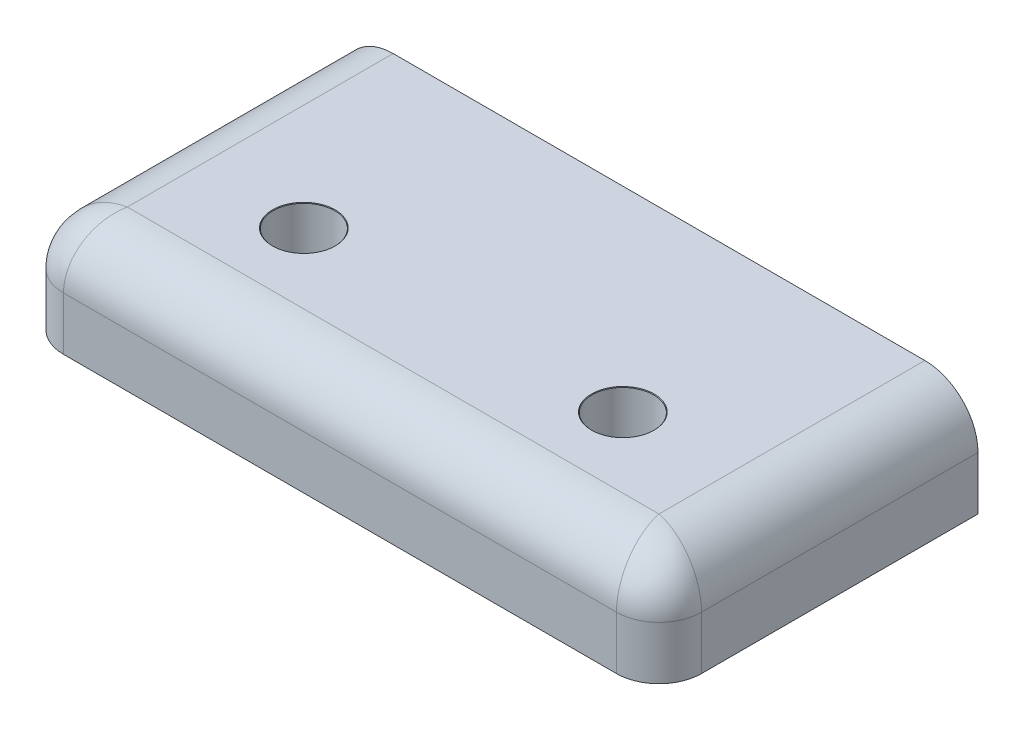
ISO-10303-21;
HEADER;
FILE_DESCRIPTION(('STEP AP214'),'2;1');
FILE_NAME('part.step','',(''),(''),'','','');
FILE_SCHEMA(('AUTOMOTIVE_DESIGN { 1 0 10303 214 1 1 1 1 }'));
ENDSEC;
DATA;
#1=APPLICATION_CONTEXT('core data for automotive mechanical design processes');
#2=APPLICATION_PROTOCOL_DEFINITION('international standard','automotive_design',2000,#1);
#3=PRODUCT_CONTEXT('',#1,'mechanical');
#4=PRODUCT('Part','Part','',(#3));
#5=PRODUCT_RELATED_PRODUCT_CATEGORY('part','',(#4));
#6=PRODUCT_DEFINITION_FORMATION('','',#4);
#7=PRODUCT_DEFINITION_CONTEXT('part definition',#1,'design');
#8=PRODUCT_DEFINITION('design','',#6,#7);
#9=PRODUCT_DEFINITION_SHAPE('','',#8);
#10=(LENGTH_UNIT() NAMED_UNIT(*) SI_UNIT(.MILLI.,.METRE.));
#11=(NAMED_UNIT(*) PLANE_ANGLE_UNIT() SI_UNIT($,.RADIAN.));
#12=(NAMED_UNIT(*) SI_UNIT($,.STERADIAN.) SOLID_ANGLE_UNIT());
#13=UNCERTAINTY_MEASURE_WITH_UNIT(LENGTH_MEASURE(1.E-05),#10,'distance_accuracy_value','');
#14=(GEOMETRIC_REPRESENTATION_CONTEXT(3) GLOBAL_UNCERTAINTY_ASSIGNED_CONTEXT((#13)) GLOBAL_UNIT_ASSIGNED_CONTEXT((#10,
#11,#12)) REPRESENTATION_CONTEXT('',''));
#15=CARTESIAN_POINT('',(0.,0.,0.));
#16=DIRECTION('',(0.,0.,1.));
#17=DIRECTION('',(1.,0.,0.));
#18=AXIS2_PLACEMENT_3D('',#15,#16,#17);
#19=CARTESIAN_POINT('',(-15.,5.,7.5));
#20=DIRECTION('',(1.,0.,0.));
#21=DIRECTION('',(0.,0.,-1.));
#22=AXIS2_PLACEMENT_3D('',#19,#20,#21);
#23=PLANE('',#22);
#24=DIRECTION('',(0.,-1.,0.));
#25=VECTOR('',#24,1.);
#26=CARTESIAN_POINT('',(-15.,5.,5.5));
#27=LINE('',#26,#25);
#28=CARTESIAN_POINT('',(-15.,0.,5.5));
#29=VERTEX_POINT('',#28);
#30=CARTESIAN_POINT('',(-15.,2.5,5.5));
#31=VERTEX_POINT('',#30);
#32=EDGE_CURVE('E144',#29,#31,#27,.F.);
#33=ORIENTED_EDGE('',*,*,#32,.T.);
#34=DIRECTION('',(0.,0.,1.));
#35=VECTOR('',#34,1.);
#36=CARTESIAN_POINT('',(-15.,2.5,-7.5));
#37=LINE('',#36,#35);
#38=CARTESIAN_POINT('',(-15.,2.5,-7.5));
#39=VERTEX_POINT('',#38);
#40=EDGE_CURVE('E11',#31,#39,#37,.F.);
#41=ORIENTED_EDGE('',*,*,#40,.T.);
#42=DIRECTION('',(0.,-1.,0.));
#43=VECTOR('',#42,1.);
#44=CARTESIAN_POINT('',(-15.,5.,-7.5));
#45=LINE('',#44,#43);
#46=CARTESIAN_POINT('',(-15.,0.,-7.5));
#47=VERTEX_POINT('',#46);
#48=EDGE_CURVE('E115',#39,#47,#45,.T.);
#49=ORIENTED_EDGE('',*,*,#48,.T.);
#50=DIRECTION('',(0.,0.,1.));
#51=VECTOR('',#50,1.);
#52=CARTESIAN_POINT('',(-15.,0.,7.5));
#53=LINE('',#52,#51);
#54=EDGE_CURVE('E129',#47,#29,#53,.T.);
#55=ORIENTED_EDGE('',*,*,#54,.T.);
#56=EDGE_LOOP('',(#33,#41,#49,#55));
#57=FACE_BOUND('',#56,.T.);
#58=ADVANCED_FACE('F35',(#57),#23,.F.);
#59=CARTESIAN_POINT('',(15.,5.,7.5));
#60=DIRECTION('',(0.,0.,-1.));
#61=DIRECTION('',(-1.,0.,0.));
#62=AXIS2_PLACEMENT_3D('',#59,#60,#61);
#63=PLANE('',#62);
#64=DIRECTION('',(0.,-1.,0.));
#65=VECTOR('',#64,1.);
#66=CARTESIAN_POINT('',(13.,5.,7.5));
#67=LINE('',#66,#65);
#68=CARTESIAN_POINT('',(13.,0.,7.5));
#69=VERTEX_POINT('',#68);
#70=CARTESIAN_POINT('',(13.,2.5,7.5));
#71=VERTEX_POINT('',#70);
#72=EDGE_CURVE('E114',#69,#71,#67,.F.);
#73=ORIENTED_EDGE('',*,*,#72,.T.);
#74=DIRECTION('',(1.,0.,0.));
#75=VECTOR('',#74,1.);
#76=CARTESIAN_POINT('',(-13.,2.5,7.5));
#77=LINE('',#76,#75);
#78=CARTESIAN_POINT('',(-13.,2.5,7.5));
#79=VERTEX_POINT('',#78);
#80=EDGE_CURVE('E60',#71,#79,#77,.F.);
#81=ORIENTED_EDGE('',*,*,#80,.T.);
#82=DIRECTION('',(0.,-1.,0.));
#83=VECTOR('',#82,1.);
#84=CARTESIAN_POINT('',(-13.,5.,7.5));
#85=LINE('',#84,#83);
#86=CARTESIAN_POINT('',(-13.,0.,7.5));
#87=VERTEX_POINT('',#86);
#88=EDGE_CURVE('E138',#79,#87,#85,.T.);
#89=ORIENTED_EDGE('',*,*,#88,.T.);
#90=DIRECTION('',(1.,0.,0.));
#91=VECTOR('',#90,1.);
#92=CARTESIAN_POINT('',(15.,0.,7.5));
#93=LINE('',#92,#91);
#94=EDGE_CURVE('E124',#87,#69,#93,.T.);
#95=ORIENTED_EDGE('',*,*,#94,.T.);
#96=EDGE_LOOP('',(#73,#81,#89,#95));
#97=FACE_BOUND('',#96,.T.);
#98=ADVANCED_FACE('F201',(#97),#63,.F.);
#99=CARTESIAN_POINT('',(15.,5.,7.5));
#100=DIRECTION('',(-1.,0.,0.));
#101=DIRECTION('',(0.,0.,1.));
#102=AXIS2_PLACEMENT_3D('',#99,#100,#101);
#103=PLANE('',#102);
#104=DIRECTION('',(0.,-1.,0.));
#105=VECTOR('',#104,1.);
#106=CARTESIAN_POINT('',(15.,5.,-7.5));
#107=LINE('',#106,#105);
#108=CARTESIAN_POINT('',(15.,2.5,-7.5));
#109=VERTEX_POINT('',#108);
#110=CARTESIAN_POINT('',(15.,0.,-7.5));
#111=VERTEX_POINT('',#110);
#112=EDGE_CURVE('E103',#109,#111,#107,.T.);
#113=ORIENTED_EDGE('',*,*,#112,.F.);
#114=DIRECTION('',(0.,0.,-1.));
#115=VECTOR('',#114,1.);
#116=CARTESIAN_POINT('',(15.,2.5,5.5));
#117=LINE('',#116,#115);
#118=CARTESIAN_POINT('',(15.,2.5,5.5));
#119=VERTEX_POINT('',#118);
#120=EDGE_CURVE('E157',#109,#119,#117,.F.);
#121=ORIENTED_EDGE('',*,*,#120,.T.);
#122=DIRECTION('',(0.,-1.,0.));
#123=VECTOR('',#122,1.);
#124=CARTESIAN_POINT('',(15.,5.,5.5));
#125=LINE('',#124,#123);
#126=CARTESIAN_POINT('',(15.,0.,5.5));
#127=VERTEX_POINT('',#126);
#128=EDGE_CURVE('E121',#119,#127,#125,.T.);
#129=ORIENTED_EDGE('',*,*,#128,.T.);
#130=DIRECTION('',(0.,0.,-1.));
#131=VECTOR('',#130,1.);
#132=CARTESIAN_POINT('',(15.,0.,7.5));
#133=LINE('',#132,#131);
#134=EDGE_CURVE('E118',#127,#111,#133,.T.);
#135=ORIENTED_EDGE('',*,*,#134,.T.);
#136=EDGE_LOOP('',(#113,#121,#129,#135));
#137=FACE_BOUND('',#136,.T.);
#138=ADVANCED_FACE('F119',(#137),#103,.F.);
#139=CARTESIAN_POINT('',(15.,5.,-7.5));
#140=DIRECTION('',(0.,0.,1.));
#141=DIRECTION('',(1.,0.,0.));
#142=AXIS2_PLACEMENT_3D('',#139,#140,#141);
#143=PLANE('',#142);
#144=DIRECTION('',(-1.,0.,0.));
#145=VECTOR('',#144,1.);
#146=CARTESIAN_POINT('',(15.,5.,-7.5));
#147=LINE('',#146,#145);
#148=CARTESIAN_POINT('',(12.5,5.,-7.5));
#149=VERTEX_POINT('',#148);
#150=CARTESIAN_POINT('',(-12.5,5.,-7.5));
#151=VERTEX_POINT('',#150);
#152=EDGE_CURVE('E130',#149,#151,#147,.T.);
#153=ORIENTED_EDGE('',*,*,#152,.F.);
#154=CARTESIAN_POINT('',(12.5,2.5,-7.5));
#155=DIRECTION('',(0.,0.,1.));
#156=DIRECTION('',(1.,0.,0.));
#157=AXIS2_PLACEMENT_3D('',#154,#155,#156);
#158=CIRCLE('',#157,2.5);
#159=EDGE_CURVE('E111',#149,#109,#158,.F.);
#160=ORIENTED_EDGE('',*,*,#159,.T.);
#161=ORIENTED_EDGE('',*,*,#112,.T.);
#162=DIRECTION('',(-1.,0.,0.));
#163=VECTOR('',#162,1.);
#164=CARTESIAN_POINT('',(15.,0.,-7.5));
#165=LINE('',#164,#163);
#166=EDGE_CURVE('E109',#111,#47,#165,.T.);
#167=ORIENTED_EDGE('',*,*,#166,.T.);
#168=ORIENTED_EDGE('',*,*,#48,.F.);
#169=CARTESIAN_POINT('',(-12.5,2.5,-7.5));
#170=DIRECTION('',(0.,0.,1.));
#171=DIRECTION('',(1.,0.,0.));
#172=AXIS2_PLACEMENT_3D('',#169,#170,#171);
#173=CIRCLE('',#172,2.5);
#174=EDGE_CURVE('E154',#39,#151,#173,.F.);
#175=ORIENTED_EDGE('',*,*,#174,.T.);
#176=EDGE_LOOP('',(#153,#160,#161,#167,#168,#175));
#177=FACE_BOUND('',#176,.T.);
#178=ADVANCED_FACE('F106',(#177),#143,.F.);
#179=CARTESIAN_POINT('',(0.,5.,0.));
#180=DIRECTION('',(0.,1.,0.));
#181=DIRECTION('',(0.,0.,1.));
#182=AXIS2_PLACEMENT_3D('',#179,#180,#181);
#183=PLANE('',#182);
#184=CARTESIAN_POINT('',(-7.5,5.,1.7));
#185=DIRECTION('',(0.,1.,0.));
#186=DIRECTION('',(0.,0.,1.));
#187=AXIS2_PLACEMENT_3D('',#184,#185,#186);
#188=CIRCLE('',#187,1.475);
#189=CARTESIAN_POINT('',(-7.5,5.,3.175));
#190=VERTEX_POINT('',#189);
#191=EDGE_CURVE('E249',#190,#190,#188,.T.);
#192=ORIENTED_EDGE('',*,*,#191,.F.);
#193=EDGE_LOOP('',(#192));
#194=FACE_BOUND('',#193,.T.);
#195=CARTESIAN_POINT('',(7.5,5.,1.7));
#196=DIRECTION('',(0.,1.,0.));
#197=DIRECTION('',(0.,0.,1.));
#198=AXIS2_PLACEMENT_3D('',#195,#196,#197);
#199=CIRCLE('',#198,1.475);
#200=CARTESIAN_POINT('',(7.5,5.,3.175));
#201=VERTEX_POINT('',#200);
#202=EDGE_CURVE('E240',#201,#201,#199,.T.);
#203=ORIENTED_EDGE('',*,*,#202,.F.);
#204=EDGE_LOOP('',(#203));
#205=FACE_BOUND('',#204,.T.);
#206=DIRECTION('',(1.,0.,0.));
#207=VECTOR('',#206,1.);
#208=CARTESIAN_POINT('',(13.,5.,5.));
#209=LINE('',#208,#207);
#210=CARTESIAN_POINT('',(-12.5,5.,5.));
#211=VERTEX_POINT('',#210);
#212=CARTESIAN_POINT('',(12.5,5.,5.));
#213=VERTEX_POINT('',#212);
#214=EDGE_CURVE('E149',#211,#213,#209,.T.);
#215=ORIENTED_EDGE('',*,*,#214,.T.);
#216=DIRECTION('',(0.,0.,-1.));
#217=VECTOR('',#216,1.);
#218=CARTESIAN_POINT('',(12.5,5.,-7.5));
#219=LINE('',#218,#217);
#220=EDGE_CURVE('E151',#213,#149,#219,.T.);
#221=ORIENTED_EDGE('',*,*,#220,.T.);
#222=ORIENTED_EDGE('',*,*,#152,.T.);
#223=DIRECTION('',(0.,0.,1.));
#224=VECTOR('',#223,1.);
#225=CARTESIAN_POINT('',(-12.5,5.,5.5));
#226=LINE('',#225,#224);
#227=EDGE_CURVE('E147',#151,#211,#226,.T.);
#228=ORIENTED_EDGE('',*,*,#227,.T.);
#229=EDGE_LOOP('',(#215,#221,#222,#228));
#230=FACE_BOUND('',#229,.T.);
#231=ADVANCED_FACE('F223',(#194,#205,#230),#183,.T.);
#232=CARTESIAN_POINT('',(0.,0.,0.));
#233=DIRECTION('',(0.,1.,0.));
#234=DIRECTION('',(0.,0.,1.));
#235=AXIS2_PLACEMENT_3D('',#232,#233,#234);
#236=PLANE('',#235);
#237=CARTESIAN_POINT('',(-7.5,0.,1.7));
#238=DIRECTION('',(0.,1.,0.));
#239=DIRECTION('',(0.,0.,1.));
#240=AXIS2_PLACEMENT_3D('',#237,#238,#239);
#241=CIRCLE('',#240,1.45);
#242=CARTESIAN_POINT('',(-7.5,0.,3.15));
#243=VERTEX_POINT('',#242);
#244=EDGE_CURVE('E243',#243,#243,#241,.T.);
#245=ORIENTED_EDGE('',*,*,#244,.T.);
#246=EDGE_LOOP('',(#245));
#247=FACE_BOUND('',#246,.T.);
#248=CARTESIAN_POINT('',(7.5,0.,1.7));
#249=DIRECTION('',(0.,1.,0.));
#250=DIRECTION('',(0.,0.,1.));
#251=AXIS2_PLACEMENT_3D('',#248,#249,#250);
#252=CIRCLE('',#251,1.45);
#253=CARTESIAN_POINT('',(7.5,0.,3.15));
#254=VERTEX_POINT('',#253);
#255=EDGE_CURVE('E167',#254,#254,#252,.T.);
#256=ORIENTED_EDGE('',*,*,#255,.T.);
#257=EDGE_LOOP('',(#256));
#258=FACE_BOUND('',#257,.T.);
#259=ORIENTED_EDGE('',*,*,#94,.F.);
#260=CARTESIAN_POINT('',(-13.,0.,5.5));
#261=DIRECTION('',(0.,1.,0.));
#262=DIRECTION('',(0.,0.,1.));
#263=AXIS2_PLACEMENT_3D('',#260,#261,#262);
#264=CIRCLE('',#263,2.);
#265=EDGE_CURVE('E142',#87,#29,#264,.F.);
#266=ORIENTED_EDGE('',*,*,#265,.T.);
#267=ORIENTED_EDGE('',*,*,#54,.F.);
#268=ORIENTED_EDGE('',*,*,#166,.F.);
#269=ORIENTED_EDGE('',*,*,#134,.F.);
#270=CARTESIAN_POINT('',(13.,0.,5.5));
#271=DIRECTION('',(0.,1.,0.));
#272=DIRECTION('',(0.,0.,1.));
#273=AXIS2_PLACEMENT_3D('',#270,#271,#272);
#274=CIRCLE('',#273,2.);
#275=EDGE_CURVE('E140',#127,#69,#274,.F.);
#276=ORIENTED_EDGE('',*,*,#275,.T.);
#277=EDGE_LOOP('',(#259,#266,#267,#268,#269,#276));
#278=FACE_BOUND('',#277,.T.);
#279=ADVANCED_FACE('F127',(#247,#258,#278),#236,.F.);
#280=CARTESIAN_POINT('',(-13.,5.,5.5));
#281=DIRECTION('',(0.,-1.,0.));
#282=DIRECTION('',(0.,0.,-1.));
#283=AXIS2_PLACEMENT_3D('',#280,#281,#282);
#284=CYLINDRICAL_SURFACE('',#283,2.);
#285=ORIENTED_EDGE('',*,*,#88,.F.);
#286=CARTESIAN_POINT('',(-13.,2.5,5.5));
#287=DIRECTION('',(0.,-1.,0.));
#288=DIRECTION('',(0.,0.,-1.));
#289=AXIS2_PLACEMENT_3D('',#286,#287,#288);
#290=CIRCLE('',#289,2.);
#291=EDGE_CURVE('E45',#79,#31,#290,.T.);
#292=ORIENTED_EDGE('',*,*,#291,.T.);
#293=ORIENTED_EDGE('',*,*,#32,.F.);
#294=ORIENTED_EDGE('',*,*,#265,.F.);
#295=EDGE_LOOP('',(#285,#292,#293,#294));
#296=FACE_BOUND('',#295,.T.);
#297=ADVANCED_FACE('F210',(#296),#284,.T.);
#298=CARTESIAN_POINT('',(13.,5.,5.5));
#299=DIRECTION('',(0.,-1.,0.));
#300=DIRECTION('',(0.,0.,-1.));
#301=AXIS2_PLACEMENT_3D('',#298,#299,#300);
#302=CYLINDRICAL_SURFACE('',#301,2.);
#303=ORIENTED_EDGE('',*,*,#128,.F.);
#304=CARTESIAN_POINT('',(13.,2.5,5.5));
#305=DIRECTION('',(0.,-1.,0.));
#306=DIRECTION('',(0.,0.,-1.));
#307=AXIS2_PLACEMENT_3D('',#304,#305,#306);
#308=CIRCLE('',#307,2.);
#309=EDGE_CURVE('E159',#119,#71,#308,.T.);
#310=ORIENTED_EDGE('',*,*,#309,.T.);
#311=ORIENTED_EDGE('',*,*,#72,.F.);
#312=ORIENTED_EDGE('',*,*,#275,.F.);
#313=EDGE_LOOP('',(#303,#310,#311,#312));
#314=FACE_BOUND('',#313,.T.);
#315=ADVANCED_FACE('F197',(#314),#302,.T.);
#316=CARTESIAN_POINT('',(-12.5,2.5,0.));
#317=DIRECTION('',(0.,0.,-1.));
#318=DIRECTION('',(-1.,0.,0.));
#319=AXIS2_PLACEMENT_3D('',#316,#317,#318);
#320=CYLINDRICAL_SURFACE('',#319,2.5);
#321=ORIENTED_EDGE('',*,*,#174,.F.);
#322=ORIENTED_EDGE('',*,*,#40,.F.);
#323=CARTESIAN_POINT('',(-12.5,2.5,5.));
#324=DIRECTION('',(0.196116135138184,0.,0.98058067569092));
#325=DIRECTION('',(-0.98058067569092,0.,0.196116135138184));
#326=AXIS2_PLACEMENT_3D('',#323,#324,#325);
#327=ELLIPSE('',#326,2.54950975679639,2.5);
#328=EDGE_CURVE('E229',#211,#31,#327,.T.);
#329=ORIENTED_EDGE('',*,*,#328,.F.);
#330=ORIENTED_EDGE('',*,*,#227,.F.);
#331=EDGE_LOOP('',(#321,#322,#329,#330));
#332=FACE_BOUND('',#331,.T.);
#333=ADVANCED_FACE('F37',(#332),#320,.T.);
#334=CARTESIAN_POINT('',(-12.5,0.,5.));
#335=CARTESIAN_POINT('',(-12.5,0.,5.));
#336=CARTESIAN_POINT('',(-12.5,0.,5.));
#337=CARTESIAN_POINT('',(-12.5217823735519,4.38190625179536E-05,5.10891186775949));
#338=CARTESIAN_POINT('',(-12.5653589836663,9.78970066464025E-05,5.06535898366626));
#339=CARTESIAN_POINT('',(-12.6089118677595,4.38190625190717E-05,5.0217823735519));
#340=CARTESIAN_POINT('',(-12.5435703088954,0.00712060928854364,5.21785154447707));
#341=CARTESIAN_POINT('',(-12.6308997973074,0.00143180709654059,5.13089979730739));
#342=CARTESIAN_POINT('',(-12.7178515444771,0.00712060928854435,5.04357030889541));
#343=CARTESIAN_POINT('',(-12.5867714969681,0.0355338138611235,5.43385748484046));
#344=CARTESIAN_POINT('',(-12.7627340708859,0.00726267264234826,5.26273407088592));
#345=CARTESIAN_POINT('',(-12.9338574848405,0.0355338138611228,5.08677149696809));
#346=CARTESIAN_POINT('',(-12.6081863603207,0.0567485116522609,5.54093180160343));
#347=CARTESIAN_POINT('',(-12.8293982502122,0.0117671299591312,5.32939825021221));
#348=CARTESIAN_POINT('',(-13.0409318016034,0.0567485116522591,5.10818636032069));
#349=CARTESIAN_POINT('',(-12.6502767096491,0.113145385695364,5.75138354824547));
#350=CARTESIAN_POINT('',(-12.9646156653177,0.0246731877577231,5.46461566531766));
#351=CARTESIAN_POINT('',(-13.2513835482455,0.113145385695362,5.15027670964909));
#352=CARTESIAN_POINT('',(-12.6709585724816,0.148087317694386,5.85479286240807));
#353=CARTESIAN_POINT('',(-13.033534737398,0.0330888143773044,5.53353473739795));
#354=CARTESIAN_POINT('',(-13.3547928624081,0.148087317694386,5.17095857248161));
#355=CARTESIAN_POINT('',(-12.7112227334933,0.231475107116418,6.05611366746671));
#356=CARTESIAN_POINT('',(-13.1744002656161,0.0554429396409673,5.67440026561609));
#357=CARTESIAN_POINT('',(-13.5561136674667,0.231475107116418,5.21122273349334));
#358=CARTESIAN_POINT('',(-12.7308195679233,0.279567098892935,6.15409783961664));
#359=CARTESIAN_POINT('',(-13.2466992961838,0.0693957374026386,5.74669929618377));
#360=CARTESIAN_POINT('',(-13.6540978396166,0.279567098892935,5.23081956792333));
#361=CARTESIAN_POINT('',(-12.76856991767,0.388543470829655,6.34284958834988));
#362=CARTESIAN_POINT('',(-13.3953567235774,0.10541149346891,5.89535672357741));
#363=CARTESIAN_POINT('',(-13.8428495883499,0.388543470829654,5.26856991766997));
#364=CARTESIAN_POINT('',(-12.7867495193356,0.448971943882772,6.43374759667783));
#365=CARTESIAN_POINT('',(-13.4720420377174,0.127477567418021,5.97204203771743));
#366=CARTESIAN_POINT('',(-13.9337475966778,0.448971943882772,5.28674951933557));
#367=CARTESIAN_POINT('',(-12.8213420383227,0.581691293487432,6.60671019161367));
#368=CARTESIAN_POINT('',(-13.6301349483202,0.183637375236751,6.13013494832021));
#369=CARTESIAN_POINT('',(-14.1067101916137,0.581691293487432,5.32134203832273));
#370=CARTESIAN_POINT('',(-12.8377958358128,0.65344424644474,6.68897917906409));
#371=CARTESIAN_POINT('',(-13.7118230669507,0.217698904903522,6.21182306695074));
#372=CARTESIAN_POINT('',(-14.1889791790641,0.653444246444741,5.33779583581282));
#373=CARTESIAN_POINT('',(-12.8686396401377,0.80766527770349,6.84319820068864));
#374=CARTESIAN_POINT('',(-13.8796879642115,0.303338883814454,6.37968796421146));
#375=CARTESIAN_POINT('',(-14.3431982006886,0.807665277703493,5.36863964013773));
#376=CARTESIAN_POINT('',(-12.883087706164,0.889546641603582,6.91543853081997));
#377=CARTESIAN_POINT('',(-13.9660687274198,0.354804154050558,6.46606872741979));
#378=CARTESIAN_POINT('',(-14.41543853082,0.889546641603584,5.38308770616399));
#379=CARTESIAN_POINT('',(-12.9096548366656,1.06266607295994,7.04827418332802));
#380=CARTESIAN_POINT('',(-14.1413114138591,0.482183976823093,6.64131141385914));
#381=CARTESIAN_POINT('',(-14.548274183328,1.06266607295994,5.4096548366656));
#382=CARTESIAN_POINT('',(-12.9218493954006,1.15331814765452,7.10924697700278));
#383=CARTESIAN_POINT('',(-14.2302635939819,0.557824061797857,6.73026359398185));
#384=CARTESIAN_POINT('',(-14.6092469770028,1.15331814765452,5.42184939540056));
#385=CARTESIAN_POINT('',(-12.9436829907165,1.3424119828983,7.21841495358267));
#386=CARTESIAN_POINT('',(-14.4057337980021,0.740810550123317,6.90573379800215));
#387=CARTESIAN_POINT('',(-14.7184149535827,1.3424119828983,5.44368299071653));
#388=CARTESIAN_POINT('',(-12.9534111045777,1.44033290463558,7.26705552288868));
#389=CARTESIAN_POINT('',(-14.4921967681334,0.847596139057215,6.99219676813343));
#390=CARTESIAN_POINT('',(-14.7670555228887,1.44033290463558,5.45341110457774));
#391=CARTESIAN_POINT('',(-12.9701326318778,1.64219618344742,7.35066315938906));
#392=CARTESIAN_POINT('',(-14.6540665155554,1.09766980710727,7.1540665155554));
#393=CARTESIAN_POINT('',(-14.8506631593891,1.64219618344742,5.47013263187781));
#394=CARTESIAN_POINT('',(-12.9772186371533,1.74574966302615,7.38609318576636));
#395=CARTESIAN_POINT('',(-14.7292756301736,1.23995381460905,7.22927563017363));
#396=CARTESIAN_POINT('',(-14.8860931857664,1.74574966302615,5.47721863715327));
#397=CARTESIAN_POINT('',(-12.9885347087233,1.95693619055351,7.44267354361676));
#398=CARTESIAN_POINT('',(-14.8571439066141,1.55907125014401,7.35714390661408));
#399=CARTESIAN_POINT('',(-14.9426735436168,1.95693619055351,5.48853470872335));
#400=CARTESIAN_POINT('',(-12.992844140155,2.06435338065055,7.46422070077484));
#401=CARTESIAN_POINT('',(-14.9095354032208,1.7343386887039,7.40953540322076));
#402=CARTESIAN_POINT('',(-14.9642207007748,2.06435338065055,5.49284414015497));
#403=CARTESIAN_POINT('',(-12.9985534982464,2.28122190556899,7.49276749123193));
#404=CARTESIAN_POINT('',(-14.9810617255807,2.10740763838908,7.4810617255807));
#405=CARTESIAN_POINT('',(-14.9927674912319,2.28122190556899,5.49855349824639));
#406=CARTESIAN_POINT('',(-13.,2.3906109527845,7.5));
#407=CARTESIAN_POINT('',(-15.,2.30313100815129,7.5));
#408=CARTESIAN_POINT('',(-15.,2.3906109527845,5.5));
#409=CARTESIAN_POINT('',(-13.,2.6093890472155,7.5));
#410=CARTESIAN_POINT('',(-15.,2.69686899184871,7.5));
#411=CARTESIAN_POINT('',(-15.,2.6093890472155,5.5));
#412=CARTESIAN_POINT('',(-12.9985534982464,2.71877809443101,7.49276749123193));
#413=CARTESIAN_POINT('',(-14.9810617255807,2.89259236161092,7.4810617255807));
#414=CARTESIAN_POINT('',(-14.9927674912319,2.71877809443101,5.49855349824639));
#415=CARTESIAN_POINT('',(-12.992844140155,2.93564661934945,7.46422070077484));
#416=CARTESIAN_POINT('',(-14.9095354032208,3.2656613112961,7.40953540322076));
#417=CARTESIAN_POINT('',(-14.9642207007748,2.93564661934945,5.49284414015497));
#418=CARTESIAN_POINT('',(-12.9885347087233,3.04306380944649,7.44267354361676));
#419=CARTESIAN_POINT('',(-14.8571439066141,3.44092874985599,7.35714390661408));
#420=CARTESIAN_POINT('',(-14.9426735436168,3.04306380944649,5.48853470872335));
#421=CARTESIAN_POINT('',(-12.9772186371533,3.25425033697385,7.38609318576637));
#422=CARTESIAN_POINT('',(-14.7292756301736,3.76004618539095,7.22927563017363));
#423=CARTESIAN_POINT('',(-14.8860931857664,3.25425033697385,5.47721863715327));
#424=CARTESIAN_POINT('',(-12.9701326318778,3.35780381655258,7.35066315938906));
#425=CARTESIAN_POINT('',(-14.6540665155554,3.90233019289273,7.1540665155554));
#426=CARTESIAN_POINT('',(-14.8506631593891,3.35780381655258,5.47013263187781));
#427=CARTESIAN_POINT('',(-12.9534111045777,3.55966709536442,7.26705552288868));
#428=CARTESIAN_POINT('',(-14.4921967681334,4.15240386094279,6.99219676813343));
#429=CARTESIAN_POINT('',(-14.7670555228887,3.55966709536442,5.45341110457774));
#430=CARTESIAN_POINT('',(-12.9436829907165,3.6575880171017,7.21841495358267));
#431=CARTESIAN_POINT('',(-14.4057337980021,4.25918944987668,6.90573379800215));
#432=CARTESIAN_POINT('',(-14.7184149535827,3.6575880171017,5.44368299071653));
#433=CARTESIAN_POINT('',(-12.9218493954006,3.84668185234548,7.10924697700278));
#434=CARTESIAN_POINT('',(-14.2302635939819,4.44217593820214,6.73026359398186));
#435=CARTESIAN_POINT('',(-14.6092469770028,3.84668185234548,5.42184939540056));
#436=CARTESIAN_POINT('',(-12.9096548366656,3.93733392704006,7.04827418332803));
#437=CARTESIAN_POINT('',(-14.1413114138591,4.51781602317691,6.64131141385914));
#438=CARTESIAN_POINT('',(-14.548274183328,3.93733392704006,5.4096548366656));
#439=CARTESIAN_POINT('',(-12.883087706164,4.11045335839642,6.91543853081998));
#440=CARTESIAN_POINT('',(-13.9660687274198,4.64519584594944,6.46606872741979));
#441=CARTESIAN_POINT('',(-14.41543853082,4.11045335839642,5.383087706164));
#442=CARTESIAN_POINT('',(-12.8686396401377,4.19233472229651,6.84319820068864));
#443=CARTESIAN_POINT('',(-13.8796879642115,4.69666111618555,6.37968796421147));
#444=CARTESIAN_POINT('',(-14.3431982006886,4.19233472229651,5.36863964013773));
#445=CARTESIAN_POINT('',(-12.8377958358128,4.34655575355526,6.68897917906409));
#446=CARTESIAN_POINT('',(-13.7118230669507,4.78230109509648,6.21182306695074));
#447=CARTESIAN_POINT('',(-14.1889791790641,4.34655575355526,5.33779583581282));
#448=CARTESIAN_POINT('',(-12.8213420383227,4.41830870651257,6.60671019161367));
#449=CARTESIAN_POINT('',(-13.6301349483202,4.81636262476325,6.13013494832021));
#450=CARTESIAN_POINT('',(-14.1067101916137,4.41830870651257,5.32134203832273));
#451=CARTESIAN_POINT('',(-12.7867495193356,4.55102805611723,6.43374759667783));
#452=CARTESIAN_POINT('',(-13.4720420377174,4.87252243258198,5.97204203771743));
#453=CARTESIAN_POINT('',(-13.9337475966778,4.55102805611723,5.28674951933557));
#454=CARTESIAN_POINT('',(-12.76856991767,4.61145652917035,6.34284958834988));
#455=CARTESIAN_POINT('',(-13.3953567235774,4.89458850653109,5.89535672357741));
#456=CARTESIAN_POINT('',(-13.8428495883499,4.61145652917035,5.26856991766997));
#457=CARTESIAN_POINT('',(-12.7308195679233,4.72043290110707,6.15409783961664));
#458=CARTESIAN_POINT('',(-13.2466992961838,4.93060426259736,5.74669929618377));
#459=CARTESIAN_POINT('',(-13.6540978396166,4.72043290110707,5.23081956792333));
#460=CARTESIAN_POINT('',(-12.7112227334933,4.76852489288358,6.05611366746671));
#461=CARTESIAN_POINT('',(-13.1744002656161,4.94455706035903,5.67440026561609));
#462=CARTESIAN_POINT('',(-13.5561136674667,4.76852489288358,5.21122273349334));
#463=CARTESIAN_POINT('',(-12.6709585724816,4.85191268230561,5.85479286240807));
#464=CARTESIAN_POINT('',(-13.033534737398,4.96691118562269,5.53353473739795));
#465=CARTESIAN_POINT('',(-13.3547928624081,4.85191268230561,5.17095857248161));
#466=CARTESIAN_POINT('',(-12.6502767096491,4.88685461430464,5.75138354824547));
#467=CARTESIAN_POINT('',(-12.9646156653177,4.97532681224228,5.46461566531766));
#468=CARTESIAN_POINT('',(-13.2513835482455,4.88685461430464,5.15027670964909));
#469=CARTESIAN_POINT('',(-12.6081863603207,4.94325148834774,5.54093180160343));
#470=CARTESIAN_POINT('',(-12.8293982502122,4.98823287004087,5.32939825021221));
#471=CARTESIAN_POINT('',(-13.0409318016034,4.94325148834774,5.10818636032069));
#472=CARTESIAN_POINT('',(-12.5867714969681,4.96446618613888,5.43385748484046));
#473=CARTESIAN_POINT('',(-12.7627340708859,4.99273732735765,5.26273407088592));
#474=CARTESIAN_POINT('',(-12.9338574848405,4.96446618613888,5.08677149696809));
#475=CARTESIAN_POINT('',(-12.5435703088954,4.99287939071146,5.21785154447707));
#476=CARTESIAN_POINT('',(-12.6308997973074,4.99856819290346,5.13089979730739));
#477=CARTESIAN_POINT('',(-12.7178515444771,4.99287939071146,5.04357030889541));
#478=CARTESIAN_POINT('',(-12.5217823735519,4.99995618093748,5.10891186775949));
#479=CARTESIAN_POINT('',(-12.5653589836663,4.99990210299335,5.06535898366626));
#480=CARTESIAN_POINT('',(-12.6089118677595,4.99995618093748,5.0217823735519));
#481=CARTESIAN_POINT('',(-12.5,5.,5.));
#482=CARTESIAN_POINT('',(-12.5,5.,5.));
#483=CARTESIAN_POINT('',(-12.5,5.,5.));
#484=(BOUNDED_SURFACE() B_SPLINE_SURFACE(3,2,((#334,#335,#336),(#337,#338,#339),(#340,#341,
#342),(#343,#344,#345),(#346,#347,#348),(#349,#350,#351),(#352,#353,#354),(#355,#356,#357),
(#358,#359,#360),(#361,#362,#363),(#364,#365,#366),(#367,#368,#369),(#370,#371,#372),(#373,#374,
#375),(#376,#377,#378),(#379,#380,#381),(#382,#383,#384),(#385,#386,#387),(#388,#389,#390),
(#391,#392,#393),(#394,#395,#396),(#397,#398,#399),(#400,#401,#402),(#403,#404,#405),(#406,#407,
#408),(#409,#410,#411),(#412,#413,#414),(#415,#416,#417),(#418,#419,#420),(#421,#422,#423),
(#424,#425,#426),(#427,#428,#429),(#430,#431,#432),(#433,#434,#435),(#436,#437,#438),(#439,#440,
#441),(#442,#443,#444),(#445,#446,#447),(#448,#449,#450),(#451,#452,#453),(#454,#455,#456),
(#457,#458,#459),(#460,#461,#462),(#463,#464,#465),(#466,#467,#468),(#469,#470,#471),(#472,#473,
#474),(#475,#476,#477),(#478,#479,#480),(#481,#482,#483)),.UNSPECIFIED.,.F.,.F.,
.F.) B_SPLINE_SURFACE_WITH_KNOTS((4,2,2,2,2,2,2,2,2,2,2,2,2,2,2,2,2,2,2,2,2,2,2,2,4),(3,3),(0.,
0.0923950270683504,0.18400470635103,0.274077820658674,0.361932038391825,0.446989850632086,
0.528816016293444,0.607156213845176,0.681975172112348,0.753489816527185,0.822188739504234,
0.888824875354154,0.954367738522642,1.01991060169113,1.08654673754105,1.1552456605181,
1.22676030493293,1.30157926320011,1.37991946075184,1.4617456264132,1.54680343865346,
1.63465765638661,1.72473077069425,1.81634044997693,1.90873547704528),(0.,1.),
.UNSPECIFIED.) GEOMETRIC_REPRESENTATION_ITEM() RATIONAL_B_SPLINE_SURFACE(((1.,1.,1.),(1.,
1.00000566557019,1.),(1.,0.998576699090688,1.),(1.,0.992910721279765,1.),(1.,0.988697681267574,
1.),(1.,0.97761712883305,1.),(1.,0.970795325018433,1.),(1.,0.954789124900482,1.),(1.,
0.945667069465631,1.),(1.,0.925487968757329,1.),(1.,0.914501756375306,1.),(1.,0.891169998194024,
1.),(1.,0.878891956959708,1.),(1.,0.853706993048538,1.),(1.,0.84084914596985,1.),(1.,
0.815387454422431,1.),(1.,0.802798170091792,1.),(1.,0.778880732263429,1.),(1.,0.767521437046521,
1.),(1.,0.747118526989836,1.),(1.,0.738001346912332,1.),(1.,0.723039691293395,1.),(1.,
0.717105167896984,1.),(1.,0.709170186451793,1.),(1.,0.707106781186548,1.),(1.,0.707106781186548,
1.),(1.,0.709170186451793,1.),(1.,0.717105167896984,1.),(1.,0.723039691293395,1.),(1.,
0.738001346912332,1.),(1.,0.747118526989835,1.),(1.,0.767521437046521,1.),(1.,0.778880732263429,
1.),(1.,0.802798170091791,1.),(1.,0.815387454422431,1.),(1.,0.84084914596985,1.),(1.,
0.853706993048538,1.),(1.,0.878891956959708,1.),(1.,0.891169998194024,1.),(1.,0.914501756375306,
1.),(1.,0.925487968757329,1.),(1.,0.945667069465631,1.),(1.,0.954789124900482,1.),(1.,
0.970795325018433,1.),(1.,0.97761712883305,1.),(1.,0.988697681267574,1.),(1.,0.992910721279765,
1.),(1.,0.998576699090688,1.),(1.,1.00000566557019,1.),(1.,1.,1.))) REPRESENTATION_ITEM('') SURFACE());
#485=ORIENTED_EDGE('',*,*,#328,.T.);
#486=ORIENTED_EDGE('',*,*,#291,.F.);
#487=CARTESIAN_POINT('',(-12.5,2.5,5.));
#488=DIRECTION('',(0.98058067569092,0.,0.196116135138184));
#489=DIRECTION('',(-0.196116135138184,0.,0.98058067569092));
#490=AXIS2_PLACEMENT_3D('',#487,#488,#489);
#491=ELLIPSE('',#490,2.54950975679639,2.5);
#492=EDGE_CURVE('E170',#211,#79,#491,.T.);
#493=ORIENTED_EDGE('',*,*,#492,.F.);
#494=EDGE_LOOP('',(#485,#486,#493));
#495=FACE_BOUND('',#494,.T.);
#496=ADVANCED_FACE('F187',(#495),#484,.T.);
#497=CARTESIAN_POINT('',(0.,2.5,5.));
#498=DIRECTION('',(-1.,0.,0.));
#499=DIRECTION('',(0.,0.,1.));
#500=AXIS2_PLACEMENT_3D('',#497,#498,#499);
#501=CYLINDRICAL_SURFACE('',#500,2.5);
#502=ORIENTED_EDGE('',*,*,#492,.T.);
#503=ORIENTED_EDGE('',*,*,#80,.F.);
#504=CARTESIAN_POINT('',(12.5,2.5,5.));
#505=DIRECTION('',(0.98058067569092,0.,-0.196116135138184));
#506=DIRECTION('',(0.196116135138184,0.,0.98058067569092));
#507=AXIS2_PLACEMENT_3D('',#504,#505,#506);
#508=ELLIPSE('',#507,2.54950975679639,2.5);
#509=EDGE_CURVE('E166',#213,#71,#508,.T.);
#510=ORIENTED_EDGE('',*,*,#509,.F.);
#511=ORIENTED_EDGE('',*,*,#214,.F.);
#512=EDGE_LOOP('',(#502,#503,#510,#511));
#513=FACE_BOUND('',#512,.T.);
#514=ADVANCED_FACE('F181',(#513),#501,.T.);
#515=CARTESIAN_POINT('',(12.5,0.,5.));
#516=CARTESIAN_POINT('',(12.5,0.,5.));
#517=CARTESIAN_POINT('',(12.5,0.,4.99999999999999));
#518=CARTESIAN_POINT('',(12.6089118677595,4.38190625190717E-05,5.02178237355189));
#519=CARTESIAN_POINT('',(12.5653589836663,9.78970066463777E-05,5.06535898366625));
#520=CARTESIAN_POINT('',(12.5217823735519,4.38190625173689E-05,5.10891186775948));
#521=CARTESIAN_POINT('',(12.7178515444771,0.00712060928854435,5.04357030889541));
#522=CARTESIAN_POINT('',(12.6308997973074,0.00143180709654032,5.13089979730739));
#523=CARTESIAN_POINT('',(12.5435703088954,0.00712060928854285,5.21785154447707));
#524=CARTESIAN_POINT('',(12.9338574848405,0.0355338138611228,5.08677149696809));
#525=CARTESIAN_POINT('',(12.7627340708859,0.00726267264234766,5.26273407088592));
#526=CARTESIAN_POINT('',(12.5867714969681,0.0355338138611226,5.43385748484046));
#527=CARTESIAN_POINT('',(13.0409318016034,0.0567485116522591,5.10818636032068));
#528=CARTESIAN_POINT('',(12.8293982502122,0.0117671299591305,5.3293982502122));
#529=CARTESIAN_POINT('',(12.6081863603207,0.05674851165226,5.54093180160342));
#530=CARTESIAN_POINT('',(13.2513835482455,0.113145385695362,5.15027670964909));
#531=CARTESIAN_POINT('',(12.9646156653177,0.0246731877577229,5.46461566531765));
#532=CARTESIAN_POINT('',(12.6502767096491,0.113145385695363,5.75138354824547));
#533=CARTESIAN_POINT('',(13.3547928624081,0.148087317694386,5.17095857248161));
#534=CARTESIAN_POINT('',(13.033534737398,0.0330888143773048,5.53353473739795));
#535=CARTESIAN_POINT('',(12.6709585724816,0.148087317694386,5.85479286240806));
#536=CARTESIAN_POINT('',(13.5561136674667,0.231475107116418,5.21122273349334));
#537=CARTESIAN_POINT('',(13.1744002656161,0.0554429396409678,5.67440026561609));
#538=CARTESIAN_POINT('',(12.7112227334933,0.231475107116418,6.05611366746671));
#539=CARTESIAN_POINT('',(13.6540978396166,0.279567098892935,5.23081956792332));
#540=CARTESIAN_POINT('',(13.2466992961838,0.0693957374026384,5.74669929618376));
#541=CARTESIAN_POINT('',(12.7308195679233,0.279567098892934,6.15409783961663));
#542=CARTESIAN_POINT('',(13.8428495883499,0.388543470829654,5.26856991766997));
#543=CARTESIAN_POINT('',(13.3953567235774,0.10541149346891,5.89535672357741));
#544=CARTESIAN_POINT('',(12.76856991767,0.388543470829654,6.34284958834987));
#545=CARTESIAN_POINT('',(13.9337475966778,0.448971943882772,5.28674951933556));
#546=CARTESIAN_POINT('',(13.4720420377174,0.127477567418021,5.97204203771743));
#547=CARTESIAN_POINT('',(12.7867495193356,0.448971943882771,6.43374759667782));
#548=CARTESIAN_POINT('',(14.1067101916137,0.581691293487433,5.32134203832273));
#549=CARTESIAN_POINT('',(13.6301349483202,0.183637375236751,6.1301349483202));
#550=CARTESIAN_POINT('',(12.8213420383227,0.581691293487431,6.60671019161367));
#551=CARTESIAN_POINT('',(14.1889791790641,0.653444246444741,5.33779583581281));
#552=CARTESIAN_POINT('',(13.7118230669507,0.217698904903522,6.21182306695073));
#553=CARTESIAN_POINT('',(12.8377958358128,0.653444246444739,6.68897917906408));
#554=CARTESIAN_POINT('',(14.3431982006886,0.807665277703492,5.36863964013772));
#555=CARTESIAN_POINT('',(13.8796879642115,0.303338883814454,6.37968796421146));
#556=CARTESIAN_POINT('',(12.8686396401377,0.807665277703489,6.84319820068864));
#557=CARTESIAN_POINT('',(14.41543853082,0.889546641603584,5.38308770616399));
#558=CARTESIAN_POINT('',(13.9660687274198,0.354804154050557,6.46606872741978));
#559=CARTESIAN_POINT('',(12.883087706164,0.889546641603581,6.91543853081997));
#560=CARTESIAN_POINT('',(14.548274183328,1.06266607295994,5.4096548366656));
#561=CARTESIAN_POINT('',(14.1413114138591,0.482183976823091,6.64131141385913));
#562=CARTESIAN_POINT('',(12.9096548366656,1.06266607295994,7.04827418332802));
#563=CARTESIAN_POINT('',(14.6092469770028,1.15331814765452,5.42184939540055));
#564=CARTESIAN_POINT('',(14.2302635939819,0.557824061797856,6.73026359398185));
#565=CARTESIAN_POINT('',(12.9218493954006,1.15331814765452,7.10924697700277));
#566=CARTESIAN_POINT('',(14.7184149535827,1.3424119828983,5.44368299071653));
#567=CARTESIAN_POINT('',(14.4057337980021,0.740810550123316,6.90573379800214));
#568=CARTESIAN_POINT('',(12.9436829907165,1.3424119828983,7.21841495358267));
#569=CARTESIAN_POINT('',(14.7670555228887,1.44033290463558,5.45341110457773));
#570=CARTESIAN_POINT('',(14.4921967681334,0.847596139057214,6.99219676813343));
#571=CARTESIAN_POINT('',(12.9534111045777,1.44033290463558,7.26705552288867));
#572=CARTESIAN_POINT('',(14.8506631593891,1.64219618344742,5.47013263187781));
#573=CARTESIAN_POINT('',(14.6540665155554,1.09766980710727,7.15406651555539));
#574=CARTESIAN_POINT('',(12.9701326318778,1.64219618344742,7.35066315938905));
#575=CARTESIAN_POINT('',(14.8860931857664,1.74574966302615,5.47721863715327));
#576=CARTESIAN_POINT('',(14.7292756301736,1.23995381460905,7.22927563017363));
#577=CARTESIAN_POINT('',(12.9772186371533,1.74574966302615,7.38609318576636));
#578=CARTESIAN_POINT('',(14.9426735436168,1.95693619055351,5.48853470872335));
#579=CARTESIAN_POINT('',(14.8571439066141,1.55907125014401,7.35714390661408));
#580=CARTESIAN_POINT('',(12.9885347087233,1.95693619055351,7.44267354361676));
#581=CARTESIAN_POINT('',(14.9642207007748,2.06435338065055,5.49284414015496));
#582=CARTESIAN_POINT('',(14.9095354032208,1.7343386887039,7.40953540322076));
#583=CARTESIAN_POINT('',(12.992844140155,2.06435338065055,7.46422070077484));
#584=CARTESIAN_POINT('',(14.9927674912319,2.28122190556899,5.49855349824638));
#585=CARTESIAN_POINT('',(14.9810617255807,2.10740763838908,7.48106172558069));
#586=CARTESIAN_POINT('',(12.9985534982464,2.28122190556899,7.49276749123193));
#587=CARTESIAN_POINT('',(15.,2.3906109527845,5.5));
#588=CARTESIAN_POINT('',(15.,2.30313100815129,7.49999999999999));
#589=CARTESIAN_POINT('',(13.,2.3906109527845,7.5));
#590=CARTESIAN_POINT('',(15.,2.6093890472155,5.5));
#591=CARTESIAN_POINT('',(15.,2.69686899184871,7.49999999999999));
#592=CARTESIAN_POINT('',(13.,2.6093890472155,7.5));
#593=CARTESIAN_POINT('',(14.9927674912319,2.71877809443101,5.49855349824638));
#594=CARTESIAN_POINT('',(14.9810617255807,2.89259236161092,7.48106172558069));
#595=CARTESIAN_POINT('',(12.9985534982464,2.71877809443101,7.49276749123193));
#596=CARTESIAN_POINT('',(14.9642207007748,2.93564661934945,5.49284414015496));
#597=CARTESIAN_POINT('',(14.9095354032208,3.2656613112961,7.40953540322076));
#598=CARTESIAN_POINT('',(12.992844140155,2.93564661934945,7.46422070077484));
#599=CARTESIAN_POINT('',(14.9426735436168,3.04306380944649,5.48853470872335));
#600=CARTESIAN_POINT('',(14.8571439066141,3.44092874985599,7.35714390661408));
#601=CARTESIAN_POINT('',(12.9885347087233,3.04306380944649,7.44267354361676));
#602=CARTESIAN_POINT('',(14.8860931857664,3.25425033697385,5.47721863715327));
#603=CARTESIAN_POINT('',(14.7292756301736,3.76004618539095,7.22927563017363));
#604=CARTESIAN_POINT('',(12.9772186371533,3.25425033697385,7.38609318576636));
#605=CARTESIAN_POINT('',(14.8506631593891,3.35780381655258,5.47013263187781));
#606=CARTESIAN_POINT('',(14.6540665155554,3.90233019289273,7.15406651555539));
#607=CARTESIAN_POINT('',(12.9701326318778,3.35780381655258,7.35066315938905));
#608=CARTESIAN_POINT('',(14.7670555228887,3.55966709536442,5.45341110457773));
#609=CARTESIAN_POINT('',(14.4921967681334,4.15240386094279,6.99219676813343));
#610=CARTESIAN_POINT('',(12.9534111045777,3.55966709536442,7.26705552288867));
#611=CARTESIAN_POINT('',(14.7184149535827,3.6575880171017,5.44368299071653));
#612=CARTESIAN_POINT('',(14.4057337980021,4.25918944987668,6.90573379800214));
#613=CARTESIAN_POINT('',(12.9436829907165,3.6575880171017,7.21841495358267));
#614=CARTESIAN_POINT('',(14.6092469770028,3.84668185234548,5.42184939540055));
#615=CARTESIAN_POINT('',(14.2302635939819,4.44217593820214,6.73026359398185));
#616=CARTESIAN_POINT('',(12.9218493954006,3.84668185234548,7.10924697700278));
#617=CARTESIAN_POINT('',(14.548274183328,3.93733392704006,5.4096548366656));
#618=CARTESIAN_POINT('',(14.1413114138591,4.51781602317691,6.64131141385913));
#619=CARTESIAN_POINT('',(12.9096548366656,3.93733392704006,7.04827418332802));
#620=CARTESIAN_POINT('',(14.41543853082,4.11045335839642,5.38308770616399));
#621=CARTESIAN_POINT('',(13.9660687274198,4.64519584594944,6.46606872741978));
#622=CARTESIAN_POINT('',(12.883087706164,4.11045335839642,6.91543853081997));
#623=CARTESIAN_POINT('',(14.3431982006886,4.19233472229651,5.36863964013772));
#624=CARTESIAN_POINT('',(13.8796879642115,4.69666111618555,6.37968796421146));
#625=CARTESIAN_POINT('',(12.8686396401377,4.19233472229651,6.84319820068864));
#626=CARTESIAN_POINT('',(14.1889791790641,4.34655575355526,5.33779583581281));
#627=CARTESIAN_POINT('',(13.7118230669507,4.78230109509648,6.21182306695073));
#628=CARTESIAN_POINT('',(12.8377958358128,4.34655575355526,6.68897917906408));
#629=CARTESIAN_POINT('',(14.1067101916137,4.41830870651257,5.32134203832273));
#630=CARTESIAN_POINT('',(13.6301349483202,4.81636262476325,6.1301349483202));
#631=CARTESIAN_POINT('',(12.8213420383227,4.41830870651257,6.60671019161367));
#632=CARTESIAN_POINT('',(13.9337475966778,4.55102805611723,5.28674951933556));
#633=CARTESIAN_POINT('',(13.4720420377174,4.87252243258198,5.97204203771743));
#634=CARTESIAN_POINT('',(12.7867495193356,4.55102805611723,6.43374759667782));
#635=CARTESIAN_POINT('',(13.8428495883499,4.61145652917035,5.26856991766997));
#636=CARTESIAN_POINT('',(13.3953567235774,4.89458850653109,5.89535672357741));
#637=CARTESIAN_POINT('',(12.76856991767,4.61145652917035,6.34284958834987));
#638=CARTESIAN_POINT('',(13.6540978396166,4.72043290110707,5.23081956792332));
#639=CARTESIAN_POINT('',(13.2466992961838,4.93060426259736,5.74669929618376));
#640=CARTESIAN_POINT('',(12.7308195679233,4.72043290110707,6.15409783961663));
#641=CARTESIAN_POINT('',(13.5561136674667,4.76852489288358,5.21122273349334));
#642=CARTESIAN_POINT('',(13.1744002656161,4.94455706035903,5.67440026561609));
#643=CARTESIAN_POINT('',(12.7112227334933,4.76852489288358,6.05611366746671));
#644=CARTESIAN_POINT('',(13.3547928624081,4.85191268230561,5.17095857248161));
#645=CARTESIAN_POINT('',(13.033534737398,4.96691118562269,5.53353473739795));
#646=CARTESIAN_POINT('',(12.6709585724816,4.85191268230562,5.85479286240806));
#647=CARTESIAN_POINT('',(13.2513835482455,4.88685461430464,5.15027670964909));
#648=CARTESIAN_POINT('',(12.9646156653177,4.97532681224228,5.46461566531765));
#649=CARTESIAN_POINT('',(12.6502767096491,4.88685461430464,5.75138354824547));
#650=CARTESIAN_POINT('',(13.0409318016034,4.94325148834774,5.10818636032068));
#651=CARTESIAN_POINT('',(12.8293982502122,4.98823287004087,5.3293982502122));
#652=CARTESIAN_POINT('',(12.6081863603207,4.94325148834774,5.54093180160342));
#653=CARTESIAN_POINT('',(12.9338574848405,4.96446618613888,5.08677149696809));
#654=CARTESIAN_POINT('',(12.7627340708859,4.99273732735765,5.26273407088592));
#655=CARTESIAN_POINT('',(12.5867714969681,4.96446618613888,5.43385748484046));
#656=CARTESIAN_POINT('',(12.7178515444771,4.99287939071146,5.04357030889541));
#657=CARTESIAN_POINT('',(12.6308997973074,4.99856819290346,5.13089979730739));
#658=CARTESIAN_POINT('',(12.5435703088954,4.99287939071146,5.21785154447707));
#659=CARTESIAN_POINT('',(12.6089118677595,4.99995618093748,5.02178237355189));
#660=CARTESIAN_POINT('',(12.5653589836663,4.99990210299335,5.06535898366625));
#661=CARTESIAN_POINT('',(12.5217823735519,4.99995618093748,5.10891186775948));
#662=CARTESIAN_POINT('',(12.5,5.,5.));
#663=CARTESIAN_POINT('',(12.5,5.,5.));
#664=CARTESIAN_POINT('',(12.5,5.,4.99999999999999));
#665=(BOUNDED_SURFACE() B_SPLINE_SURFACE(3,2,((#515,#516,#517),(#518,#519,#520),(#521,#522,
#523),(#524,#525,#526),(#527,#528,#529),(#530,#531,#532),(#533,#534,#535),(#536,#537,#538),
(#539,#540,#541),(#542,#543,#544),(#545,#546,#547),(#548,#549,#550),(#551,#552,#553),(#554,#555,
#556),(#557,#558,#559),(#560,#561,#562),(#563,#564,#565),(#566,#567,#568),(#569,#570,#571),
(#572,#573,#574),(#575,#576,#577),(#578,#579,#580),(#581,#582,#583),(#584,#585,#586),(#587,#588,
#589),(#590,#591,#592),(#593,#594,#595),(#596,#597,#598),(#599,#600,#601),(#602,#603,#604),
(#605,#606,#607),(#608,#609,#610),(#611,#612,#613),(#614,#615,#616),(#617,#618,#619),(#620,#621,
#622),(#623,#624,#625),(#626,#627,#628),(#629,#630,#631),(#632,#633,#634),(#635,#636,#637),
(#638,#639,#640),(#641,#642,#643),(#644,#645,#646),(#647,#648,#649),(#650,#651,#652),(#653,#654,
#655),(#656,#657,#658),(#659,#660,#661),(#662,#663,#664)),.UNSPECIFIED.,.F.,.F.,
.F.) B_SPLINE_SURFACE_WITH_KNOTS((4,2,2,2,2,2,2,2,2,2,2,2,2,2,2,2,2,2,2,2,2,2,2,2,4),(3,3),(0.,
0.0923950270683504,0.18400470635103,0.274077820658674,0.361932038391825,0.446989850632086,
0.528816016293444,0.607156213845176,0.681975172112348,0.753489816527185,0.822188739504234,
0.888824875354153,0.954367738522642,1.01991060169113,1.08654673754105,1.1552456605181,
1.22676030493293,1.30157926320011,1.37991946075184,1.4617456264132,1.54680343865346,
1.63465765638661,1.72473077069425,1.81634044997693,1.90873547704528),(0.,1.),
.UNSPECIFIED.) GEOMETRIC_REPRESENTATION_ITEM() RATIONAL_B_SPLINE_SURFACE(((1.,1.,1.),(1.,
1.00000566557019,1.),(1.,0.998576699090688,1.),(1.,0.992910721279765,1.),(1.,0.988697681267574,
1.),(1.,0.97761712883305,1.),(1.,0.970795325018433,1.),(1.,0.954789124900482,1.),(1.,
0.945667069465631,1.),(1.,0.92548796875733,1.),(1.,0.914501756375306,1.),(1.,0.891169998194024,
1.),(1.,0.878891956959708,1.),(1.,0.853706993048538,1.),(1.,0.84084914596985,1.),(1.,
0.815387454422431,1.),(1.,0.802798170091792,1.),(1.,0.778880732263429,1.),(1.,0.767521437046521,
1.),(1.,0.747118526989836,1.),(1.,0.738001346912332,1.),(1.,0.723039691293395,1.),(1.,
0.717105167896984,1.),(1.,0.709170186451793,1.),(1.,0.707106781186548,1.),(1.,0.707106781186548,
1.),(1.,0.709170186451793,1.),(1.,0.717105167896984,1.),(1.,0.723039691293395,1.),(1.,
0.738001346912332,1.),(1.,0.747118526989835,1.),(1.,0.767521437046521,1.),(1.,0.778880732263429,
1.),(1.,0.802798170091792,1.),(1.,0.815387454422431,1.),(1.,0.84084914596985,1.),(1.,
0.853706993048538,1.),(1.,0.878891956959708,1.),(1.,0.891169998194024,1.),(1.,0.914501756375306,
1.),(1.,0.92548796875733,1.),(1.,0.945667069465631,1.),(1.,0.954789124900482,1.),(1.,
0.970795325018433,1.),(1.,0.97761712883305,1.),(1.,0.988697681267574,1.),(1.,0.992910721279765,
1.),(1.,0.998576699090688,1.),(1.,1.00000566557019,1.),(1.,1.,1.))) REPRESENTATION_ITEM('') SURFACE());
#666=ORIENTED_EDGE('',*,*,#509,.T.);
#667=ORIENTED_EDGE('',*,*,#309,.F.);
#668=CARTESIAN_POINT('',(12.5,2.5,5.));
#669=DIRECTION('',(0.196116135138184,0.,-0.98058067569092));
#670=DIRECTION('',(0.98058067569092,0.,0.196116135138184));
#671=AXIS2_PLACEMENT_3D('',#668,#669,#670);
#672=ELLIPSE('',#671,2.54950975679639,2.5);
#673=EDGE_CURVE('E163',#213,#119,#672,.T.);
#674=ORIENTED_EDGE('',*,*,#673,.F.);
#675=EDGE_LOOP('',(#666,#667,#674));
#676=FACE_BOUND('',#675,.T.);
#677=ADVANCED_FACE('F174',(#676),#665,.T.);
#678=CARTESIAN_POINT('',(12.5,2.5,0.));
#679=DIRECTION('',(0.,0.,1.));
#680=DIRECTION('',(1.,0.,0.));
#681=AXIS2_PLACEMENT_3D('',#678,#679,#680);
#682=CYLINDRICAL_SURFACE('',#681,2.5);
#683=ORIENTED_EDGE('',*,*,#673,.T.);
#684=ORIENTED_EDGE('',*,*,#120,.F.);
#685=ORIENTED_EDGE('',*,*,#159,.F.);
#686=ORIENTED_EDGE('',*,*,#220,.F.);
#687=EDGE_LOOP('',(#683,#684,#685,#686));
#688=FACE_BOUND('',#687,.T.);
#689=ADVANCED_FACE('F180',(#688),#682,.T.);
#690=CARTESIAN_POINT('',(7.5,5.,1.7));
#691=DIRECTION('',(0.,1.,0.));
#692=DIRECTION('',(0.,0.,1.));
#693=AXIS2_PLACEMENT_3D('',#690,#691,#692);
#694=CYLINDRICAL_SURFACE('',#693,1.45);
#695=ORIENTED_EDGE('',*,*,#255,.F.);
#696=EDGE_LOOP('',(#695));
#697=FACE_BOUND('',#696,.T.);
#698=CARTESIAN_POINT('',(7.5,4.975,1.7));
#699=DIRECTION('',(0.,1.,0.));
#700=DIRECTION('',(0.,0.,1.));
#701=AXIS2_PLACEMENT_3D('',#698,#699,#700);
#702=CIRCLE('',#701,1.45);
#703=CARTESIAN_POINT('',(7.5,4.975,3.15));
#704=VERTEX_POINT('',#703);
#705=EDGE_CURVE('E237',#704,#704,#702,.T.);
#706=ORIENTED_EDGE('',*,*,#705,.T.);
#707=EDGE_LOOP('',(#706));
#708=FACE_BOUND('',#707,.T.);
#709=ADVANCED_FACE('F263',(#697,#708),#694,.F.);
#710=CARTESIAN_POINT('',(7.5,5.,1.7));
#711=DIRECTION('',(0.,1.,0.));
#712=DIRECTION('',(0.,0.,1.));
#713=AXIS2_PLACEMENT_3D('',#710,#711,#712);
#714=CONICAL_SURFACE('',#713,1.475,0.785398163397448);
#715=ORIENTED_EDGE('',*,*,#705,.F.);
#716=EDGE_LOOP('',(#715));
#717=FACE_BOUND('',#716,.T.);
#718=ORIENTED_EDGE('',*,*,#202,.T.);
#719=EDGE_LOOP('',(#718));
#720=FACE_BOUND('',#719,.T.);
#721=ADVANCED_FACE('F260',(#717,#720),#714,.F.);
#722=CARTESIAN_POINT('',(-7.5,5.,1.7));
#723=DIRECTION('',(0.,1.,0.));
#724=DIRECTION('',(0.,0.,1.));
#725=AXIS2_PLACEMENT_3D('',#722,#723,#724);
#726=CYLINDRICAL_SURFACE('',#725,1.45);
#727=ORIENTED_EDGE('',*,*,#244,.F.);
#728=EDGE_LOOP('',(#727));
#729=FACE_BOUND('',#728,.T.);
#730=CARTESIAN_POINT('',(-7.5,4.975,1.7));
#731=DIRECTION('',(0.,1.,0.));
#732=DIRECTION('',(0.,0.,1.));
#733=AXIS2_PLACEMENT_3D('',#730,#731,#732);
#734=CIRCLE('',#733,1.45);
#735=CARTESIAN_POINT('',(-7.5,4.975,3.15));
#736=VERTEX_POINT('',#735);
#737=EDGE_CURVE('E246',#736,#736,#734,.T.);
#738=ORIENTED_EDGE('',*,*,#737,.T.);
#739=EDGE_LOOP('',(#738));
#740=FACE_BOUND('',#739,.T.);
#741=ADVANCED_FACE('F262',(#729,#740),#726,.F.);
#742=CARTESIAN_POINT('',(-7.5,5.,1.7));
#743=DIRECTION('',(0.,1.,0.));
#744=DIRECTION('',(0.,0.,1.));
#745=AXIS2_PLACEMENT_3D('',#742,#743,#744);
#746=CONICAL_SURFACE('',#745,1.475,0.785398163397466);
#747=ORIENTED_EDGE('',*,*,#737,.F.);
#748=EDGE_LOOP('',(#747));
#749=FACE_BOUND('',#748,.T.);
#750=ORIENTED_EDGE('',*,*,#191,.T.);
#751=EDGE_LOOP('',(#750));
#752=FACE_BOUND('',#751,.T.);
#753=ADVANCED_FACE('F253',(#749,#752),#746,.F.);
#754=CLOSED_SHELL('',(#58,#98,#138,#178,#231,#279,#297,#315,#333,#496,#514,#677,#689,#709,#721,
#741,#753));
#755=MANIFOLD_SOLID_BREP('B2',#754);
#756=ADVANCED_BREP_SHAPE_REPRESENTATION('',(#18,#755),#14);
#757=SHAPE_DEFINITION_REPRESENTATION(#9,#756);
ENDSEC;
END-ISO-10303-21;
